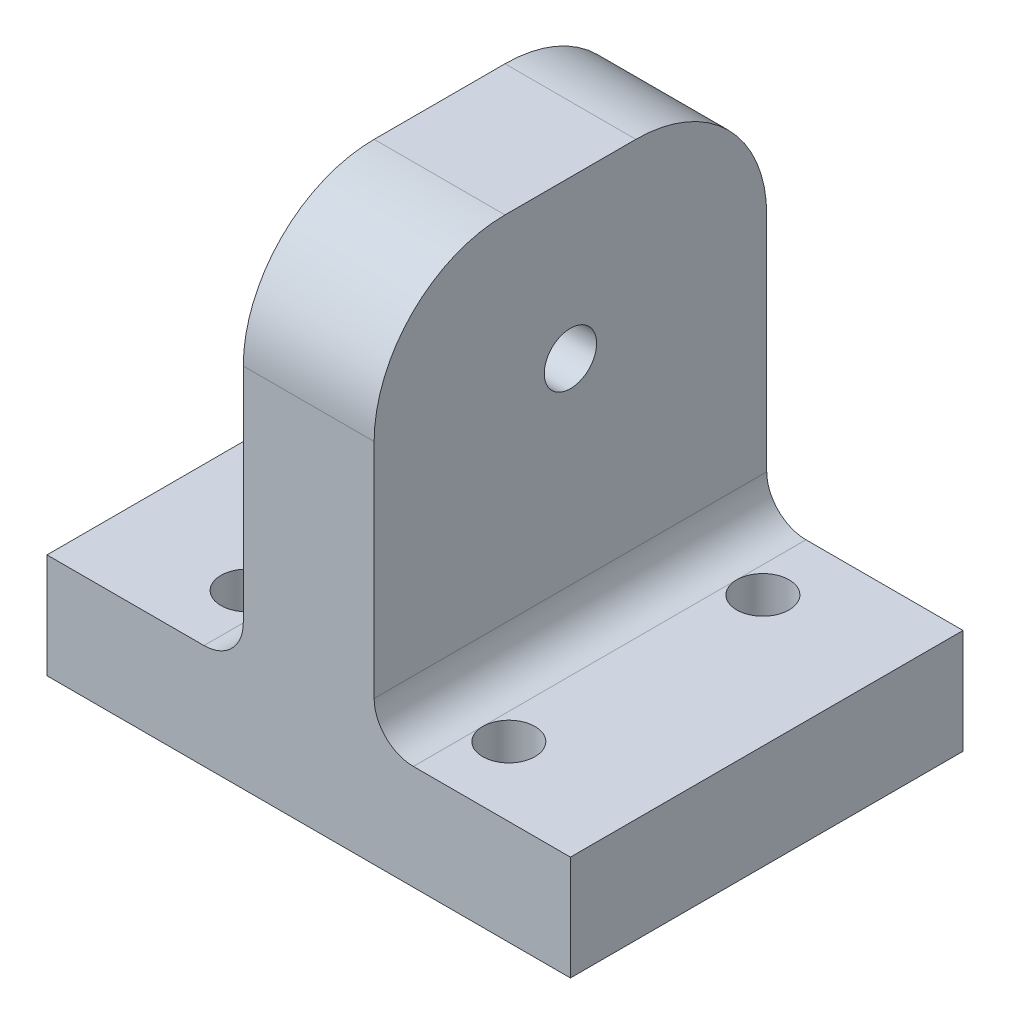
ISO-10303-21;
HEADER;
FILE_DESCRIPTION(('STEP AP214'),'2;1');
FILE_NAME('part.step','',(''),(''),'','','');
FILE_SCHEMA(('AUTOMOTIVE_DESIGN { 1 0 10303 214 1 1 1 1 }'));
ENDSEC;
DATA;
#1=APPLICATION_CONTEXT('core data for automotive mechanical design processes');
#2=APPLICATION_PROTOCOL_DEFINITION('international standard','automotive_design',2000,#1);
#3=PRODUCT_CONTEXT('',#1,'mechanical');
#4=PRODUCT('Part','Part','',(#3));
#5=PRODUCT_RELATED_PRODUCT_CATEGORY('part','',(#4));
#6=PRODUCT_DEFINITION_FORMATION('','',#4);
#7=PRODUCT_DEFINITION_CONTEXT('part definition',#1,'design');
#8=PRODUCT_DEFINITION('design','',#6,#7);
#9=PRODUCT_DEFINITION_SHAPE('','',#8);
#10=(LENGTH_UNIT() NAMED_UNIT(*) SI_UNIT(.MILLI.,.METRE.));
#11=(NAMED_UNIT(*) PLANE_ANGLE_UNIT() SI_UNIT($,.RADIAN.));
#12=(NAMED_UNIT(*) SI_UNIT($,.STERADIAN.) SOLID_ANGLE_UNIT());
#13=UNCERTAINTY_MEASURE_WITH_UNIT(LENGTH_MEASURE(1.E-05),#10,'distance_accuracy_value','');
#14=(GEOMETRIC_REPRESENTATION_CONTEXT(3) GLOBAL_UNCERTAINTY_ASSIGNED_CONTEXT((#13)) GLOBAL_UNIT_ASSIGNED_CONTEXT((#10,
#11,#12)) REPRESENTATION_CONTEXT('',''));
#15=CARTESIAN_POINT('',(0.,0.,0.));
#16=DIRECTION('',(0.,0.,1.));
#17=DIRECTION('',(1.,0.,0.));
#18=AXIS2_PLACEMENT_3D('',#15,#16,#17);
#19=CARTESIAN_POINT('',(0.,8.,0.));
#20=DIRECTION('',(0.,1.,0.));
#21=DIRECTION('',(0.,0.,1.));
#22=AXIS2_PLACEMENT_3D('',#19,#20,#21);
#23=PLANE('',#22);
#24=DIRECTION('',(0.,0.,-1.));
#25=VECTOR('',#24,1.);
#26=CARTESIAN_POINT('',(8.,8.,0.));
#27=LINE('',#26,#25);
#28=CARTESIAN_POINT('',(8.,8.,-15.));
#29=VERTEX_POINT('',#28);
#30=CARTESIAN_POINT('',(8.,8.,-9.70683257072213));
#31=VERTEX_POINT('',#30);
#32=EDGE_CURVE('E193',#29,#31,#27,.F.);
#33=ORIENTED_EDGE('',*,*,#32,.T.);
#34=CARTESIAN_POINT('',(10.,8.,-9.70683257072213));
#35=DIRECTION('',(0.,1.,0.));
#36=DIRECTION('',(0.,0.,1.));
#37=AXIS2_PLACEMENT_3D('',#34,#35,#36);
#38=CIRCLE('',#37,2.);
#39=EDGE_CURVE('E319',#31,#31,#38,.T.);
#40=ORIENTED_EDGE('',*,*,#39,.F.);
#41=CARTESIAN_POINT('',(8.,8.,9.70683257072212));
#42=VERTEX_POINT('',#41);
#43=EDGE_CURVE('E197',#31,#42,#27,.F.);
#44=ORIENTED_EDGE('',*,*,#43,.T.);
#45=CARTESIAN_POINT('',(10.,8.,9.70683257072212));
#46=DIRECTION('',(0.,1.,0.));
#47=DIRECTION('',(0.,0.,1.));
#48=AXIS2_PLACEMENT_3D('',#45,#46,#47);
#49=CIRCLE('',#48,2.);
#50=EDGE_CURVE('E322',#42,#42,#49,.T.);
#51=ORIENTED_EDGE('',*,*,#50,.F.);
#52=CARTESIAN_POINT('',(8.,8.,15.));
#53=VERTEX_POINT('',#52);
#54=EDGE_CURVE('E192',#42,#53,#27,.F.);
#55=ORIENTED_EDGE('',*,*,#54,.T.);
#56=DIRECTION('',(1.,0.,0.));
#57=VECTOR('',#56,1.);
#58=CARTESIAN_POINT('',(-20.,8.,15.));
#59=LINE('',#58,#57);
#60=CARTESIAN_POINT('',(20.,8.,15.));
#61=VERTEX_POINT('',#60);
#62=EDGE_CURVE('E159',#53,#61,#59,.T.);
#63=ORIENTED_EDGE('',*,*,#62,.T.);
#64=DIRECTION('',(0.,0.,-1.));
#65=VECTOR('',#64,1.);
#66=CARTESIAN_POINT('',(20.,8.,-15.));
#67=LINE('',#66,#65);
#68=CARTESIAN_POINT('',(20.,8.,-15.));
#69=VERTEX_POINT('',#68);
#70=EDGE_CURVE('E157',#61,#69,#67,.T.);
#71=ORIENTED_EDGE('',*,*,#70,.T.);
#72=DIRECTION('',(-1.,0.,0.));
#73=VECTOR('',#72,1.);
#74=CARTESIAN_POINT('',(-20.,8.,-15.));
#75=LINE('',#74,#73);
#76=EDGE_CURVE('E141',#69,#29,#75,.T.);
#77=ORIENTED_EDGE('',*,*,#76,.T.);
#78=EDGE_LOOP('',(#33,#40,#44,#51,#55,#63,#71,#77));
#79=FACE_BOUND('',#78,.T.);
#80=ADVANCED_FACE('F39',(#79),#23,.T.);
#81=CARTESIAN_POINT('',(20.,8.,-15.));
#82=DIRECTION('',(-1.,0.,0.));
#83=DIRECTION('',(0.,0.,1.));
#84=AXIS2_PLACEMENT_3D('',#81,#82,#83);
#85=PLANE('',#84);
#86=DIRECTION('',(0.,0.,-1.));
#87=VECTOR('',#86,1.);
#88=CARTESIAN_POINT('',(20.,0.,-15.));
#89=LINE('',#88,#87);
#90=CARTESIAN_POINT('',(20.,0.,15.));
#91=VERTEX_POINT('',#90);
#92=CARTESIAN_POINT('',(20.,0.,-15.));
#93=VERTEX_POINT('',#92);
#94=EDGE_CURVE('E168',#91,#93,#89,.T.);
#95=ORIENTED_EDGE('',*,*,#94,.T.);
#96=DIRECTION('',(0.,-1.,0.));
#97=VECTOR('',#96,1.);
#98=CARTESIAN_POINT('',(20.,8.,-15.));
#99=LINE('',#98,#97);
#100=EDGE_CURVE('E145',#69,#93,#99,.T.);
#101=ORIENTED_EDGE('',*,*,#100,.F.);
#102=ORIENTED_EDGE('',*,*,#70,.F.);
#103=DIRECTION('',(0.,-1.,0.));
#104=VECTOR('',#103,1.);
#105=CARTESIAN_POINT('',(20.,8.,15.));
#106=LINE('',#105,#104);
#107=EDGE_CURVE('E268',#61,#91,#106,.T.);
#108=ORIENTED_EDGE('',*,*,#107,.T.);
#109=EDGE_LOOP('',(#95,#101,#102,#108));
#110=FACE_BOUND('',#109,.T.);
#111=ADVANCED_FACE('F166',(#110),#85,.F.);
#112=CARTESIAN_POINT('',(-20.,8.,-15.));
#113=DIRECTION('',(0.,0.,1.));
#114=DIRECTION('',(1.,0.,0.));
#115=AXIS2_PLACEMENT_3D('',#112,#113,#114);
#116=PLANE('',#115);
#117=DIRECTION('',(0.,-1.,0.));
#118=VECTOR('',#117,1.);
#119=CARTESIAN_POINT('',(-5.,38.,-15.));
#120=LINE('',#119,#118);
#121=CARTESIAN_POINT('',(-5.,28.,-15.));
#122=VERTEX_POINT('',#121);
#123=CARTESIAN_POINT('',(-5.,11.,-15.));
#124=VERTEX_POINT('',#123);
#125=EDGE_CURVE('E253',#122,#124,#120,.T.);
#126=ORIENTED_EDGE('',*,*,#125,.F.);
#127=DIRECTION('',(-1.,0.,0.));
#128=VECTOR('',#127,1.);
#129=CARTESIAN_POINT('',(5.,28.,-15.));
#130=LINE('',#129,#128);
#131=CARTESIAN_POINT('',(5.,28.,-15.));
#132=VERTEX_POINT('',#131);
#133=EDGE_CURVE('E11',#122,#132,#130,.F.);
#134=ORIENTED_EDGE('',*,*,#133,.T.);
#135=DIRECTION('',(0.,-1.,0.));
#136=VECTOR('',#135,1.);
#137=CARTESIAN_POINT('',(5.,38.,-15.));
#138=LINE('',#137,#136);
#139=CARTESIAN_POINT('',(5.,11.,-15.));
#140=VERTEX_POINT('',#139);
#141=EDGE_CURVE('E259',#132,#140,#138,.T.);
#142=ORIENTED_EDGE('',*,*,#141,.T.);
#143=CARTESIAN_POINT('',(8.,11.,-15.));
#144=DIRECTION('',(0.,0.,1.));
#145=DIRECTION('',(1.,0.,0.));
#146=AXIS2_PLACEMENT_3D('',#143,#144,#145);
#147=CIRCLE('',#146,3.);
#148=EDGE_CURVE('E148',#140,#29,#147,.T.);
#149=ORIENTED_EDGE('',*,*,#148,.T.);
#150=ORIENTED_EDGE('',*,*,#76,.F.);
#151=ORIENTED_EDGE('',*,*,#100,.T.);
#152=DIRECTION('',(-1.,0.,0.));
#153=VECTOR('',#152,1.);
#154=CARTESIAN_POINT('',(-20.,0.,-15.));
#155=LINE('',#154,#153);
#156=CARTESIAN_POINT('',(-20.,0.,-15.));
#157=VERTEX_POINT('',#156);
#158=EDGE_CURVE('E271',#93,#157,#155,.T.);
#159=ORIENTED_EDGE('',*,*,#158,.T.);
#160=DIRECTION('',(0.,-1.,0.));
#161=VECTOR('',#160,1.);
#162=CARTESIAN_POINT('',(-20.,8.,-15.));
#163=LINE('',#162,#161);
#164=CARTESIAN_POINT('',(-20.,8.,-15.));
#165=VERTEX_POINT('',#164);
#166=EDGE_CURVE('E171',#165,#157,#163,.T.);
#167=ORIENTED_EDGE('',*,*,#166,.F.);
#168=CARTESIAN_POINT('',(-8.,8.,-15.));
#169=VERTEX_POINT('',#168);
#170=EDGE_CURVE('E154',#169,#165,#75,.T.);
#171=ORIENTED_EDGE('',*,*,#170,.F.);
#172=CARTESIAN_POINT('',(-8.,11.,-15.));
#173=DIRECTION('',(0.,0.,1.));
#174=DIRECTION('',(1.,0.,0.));
#175=AXIS2_PLACEMENT_3D('',#172,#173,#174);
#176=CIRCLE('',#175,3.);
#177=EDGE_CURVE('E200',#169,#124,#176,.T.);
#178=ORIENTED_EDGE('',*,*,#177,.T.);
#179=EDGE_LOOP('',(#126,#134,#142,#149,#150,#151,#159,#167,#171,#178));
#180=FACE_BOUND('',#179,.T.);
#181=ADVANCED_FACE('F143',(#180),#116,.F.);
#182=CARTESIAN_POINT('',(-20.,8.,-15.));
#183=DIRECTION('',(1.,0.,0.));
#184=DIRECTION('',(0.,0.,-1.));
#185=AXIS2_PLACEMENT_3D('',#182,#183,#184);
#186=PLANE('',#185);
#187=DIRECTION('',(0.,0.,1.));
#188=VECTOR('',#187,1.);
#189=CARTESIAN_POINT('',(-20.,0.,-15.));
#190=LINE('',#189,#188);
#191=CARTESIAN_POINT('',(-20.,0.,15.));
#192=VERTEX_POINT('',#191);
#193=EDGE_CURVE('E274',#157,#192,#190,.T.);
#194=ORIENTED_EDGE('',*,*,#193,.T.);
#195=DIRECTION('',(0.,-1.,0.));
#196=VECTOR('',#195,1.);
#197=CARTESIAN_POINT('',(-20.,8.,15.));
#198=LINE('',#197,#196);
#199=CARTESIAN_POINT('',(-20.,8.,15.));
#200=VERTEX_POINT('',#199);
#201=EDGE_CURVE('E179',#200,#192,#198,.T.);
#202=ORIENTED_EDGE('',*,*,#201,.F.);
#203=DIRECTION('',(0.,0.,1.));
#204=VECTOR('',#203,1.);
#205=CARTESIAN_POINT('',(-20.,8.,-15.));
#206=LINE('',#205,#204);
#207=EDGE_CURVE('E153',#165,#200,#206,.T.);
#208=ORIENTED_EDGE('',*,*,#207,.F.);
#209=ORIENTED_EDGE('',*,*,#166,.T.);
#210=EDGE_LOOP('',(#194,#202,#208,#209));
#211=FACE_BOUND('',#210,.T.);
#212=ADVANCED_FACE('F292',(#211),#186,.F.);
#213=CARTESIAN_POINT('',(-20.,8.,15.));
#214=DIRECTION('',(0.,0.,-1.));
#215=DIRECTION('',(-1.,0.,0.));
#216=AXIS2_PLACEMENT_3D('',#213,#214,#215);
#217=PLANE('',#216);
#218=DIRECTION('',(0.,-1.,0.));
#219=VECTOR('',#218,1.);
#220=CARTESIAN_POINT('',(5.,38.,15.));
#221=LINE('',#220,#219);
#222=CARTESIAN_POINT('',(5.,28.,15.));
#223=VERTEX_POINT('',#222);
#224=CARTESIAN_POINT('',(5.,11.,15.));
#225=VERTEX_POINT('',#224);
#226=EDGE_CURVE('E241',#223,#225,#221,.T.);
#227=ORIENTED_EDGE('',*,*,#226,.F.);
#228=DIRECTION('',(1.,0.,0.));
#229=VECTOR('',#228,1.);
#230=CARTESIAN_POINT('',(-5.,28.,15.));
#231=LINE('',#230,#229);
#232=CARTESIAN_POINT('',(-5.,28.,15.));
#233=VERTEX_POINT('',#232);
#234=EDGE_CURVE('E63',#223,#233,#231,.F.);
#235=ORIENTED_EDGE('',*,*,#234,.T.);
#236=DIRECTION('',(0.,-1.,0.));
#237=VECTOR('',#236,1.);
#238=CARTESIAN_POINT('',(-5.,38.,15.));
#239=LINE('',#238,#237);
#240=CARTESIAN_POINT('',(-5.,11.,15.));
#241=VERTEX_POINT('',#240);
#242=EDGE_CURVE('E232',#233,#241,#239,.T.);
#243=ORIENTED_EDGE('',*,*,#242,.T.);
#244=CARTESIAN_POINT('',(-8.,11.,15.));
#245=DIRECTION('',(0.,0.,-1.));
#246=DIRECTION('',(-1.,0.,0.));
#247=AXIS2_PLACEMENT_3D('',#244,#245,#246);
#248=CIRCLE('',#247,3.);
#249=CARTESIAN_POINT('',(-8.,8.,15.));
#250=VERTEX_POINT('',#249);
#251=EDGE_CURVE('E196',#241,#250,#248,.T.);
#252=ORIENTED_EDGE('',*,*,#251,.T.);
#253=EDGE_CURVE('E264',#200,#250,#59,.T.);
#254=ORIENTED_EDGE('',*,*,#253,.F.);
#255=ORIENTED_EDGE('',*,*,#201,.T.);
#256=DIRECTION('',(1.,0.,0.));
#257=VECTOR('',#256,1.);
#258=CARTESIAN_POINT('',(-20.,0.,15.));
#259=LINE('',#258,#257);
#260=EDGE_CURVE('E164',#192,#91,#259,.T.);
#261=ORIENTED_EDGE('',*,*,#260,.T.);
#262=ORIENTED_EDGE('',*,*,#107,.F.);
#263=ORIENTED_EDGE('',*,*,#62,.F.);
#264=CARTESIAN_POINT('',(8.,11.,15.));
#265=DIRECTION('',(0.,0.,-1.));
#266=DIRECTION('',(-1.,0.,0.));
#267=AXIS2_PLACEMENT_3D('',#264,#265,#266);
#268=CIRCLE('',#267,3.);
#269=EDGE_CURVE('E206',#53,#225,#268,.T.);
#270=ORIENTED_EDGE('',*,*,#269,.T.);
#271=EDGE_LOOP('',(#227,#235,#243,#252,#254,#255,#261,#262,#263,#270));
#272=FACE_BOUND('',#271,.T.);
#273=ADVANCED_FACE('F247',(#272),#217,.F.);
#274=DIRECTION('',(0.,0.,1.));
#275=VECTOR('',#274,1.);
#276=CARTESIAN_POINT('',(-8.,8.,0.));
#277=LINE('',#276,#275);
#278=CARTESIAN_POINT('',(-8.,8.,9.70683257072212));
#279=VERTEX_POINT('',#278);
#280=CARTESIAN_POINT('',(-8.,8.,-9.70683257072212));
#281=VERTEX_POINT('',#280);
#282=EDGE_CURVE('E188',#279,#281,#277,.F.);
#283=ORIENTED_EDGE('',*,*,#282,.T.);
#284=CARTESIAN_POINT('',(-10.,8.,-9.70683257072212));
#285=DIRECTION('',(0.,1.,0.));
#286=DIRECTION('',(0.,0.,1.));
#287=AXIS2_PLACEMENT_3D('',#284,#285,#286);
#288=CIRCLE('',#287,2.);
#289=EDGE_CURVE('E312',#281,#281,#288,.T.);
#290=ORIENTED_EDGE('',*,*,#289,.F.);
#291=EDGE_CURVE('E176',#281,#169,#277,.F.);
#292=ORIENTED_EDGE('',*,*,#291,.T.);
#293=ORIENTED_EDGE('',*,*,#170,.T.);
#294=ORIENTED_EDGE('',*,*,#207,.T.);
#295=ORIENTED_EDGE('',*,*,#253,.T.);
#296=EDGE_CURVE('E183',#250,#279,#277,.F.);
#297=ORIENTED_EDGE('',*,*,#296,.T.);
#298=CARTESIAN_POINT('',(-10.,8.,9.70683257072212));
#299=DIRECTION('',(0.,1.,0.));
#300=DIRECTION('',(0.,0.,1.));
#301=AXIS2_PLACEMENT_3D('',#298,#299,#300);
#302=CIRCLE('',#301,2.);
#303=EDGE_CURVE('E314',#279,#279,#302,.T.);
#304=ORIENTED_EDGE('',*,*,#303,.F.);
#305=EDGE_LOOP('',(#283,#290,#292,#293,#294,#295,#297,#304));
#306=FACE_BOUND('',#305,.T.);
#307=ADVANCED_FACE('F295',(#306),#23,.T.);
#308=CARTESIAN_POINT('',(0.,0.,0.));
#309=DIRECTION('',(0.,1.,0.));
#310=DIRECTION('',(0.,0.,1.));
#311=AXIS2_PLACEMENT_3D('',#308,#309,#310);
#312=PLANE('',#311);
#313=CARTESIAN_POINT('',(-10.,0.,-9.70683257072212));
#314=DIRECTION('',(0.,-1.,0.));
#315=DIRECTION('',(0.,0.,1.));
#316=AXIS2_PLACEMENT_3D('',#313,#314,#315);
#317=CIRCLE('',#316,2.);
#318=CARTESIAN_POINT('',(-10.,0.,-7.70683257072212));
#319=VERTEX_POINT('',#318);
#320=EDGE_CURVE('E330',#319,#319,#317,.T.);
#321=ORIENTED_EDGE('',*,*,#320,.F.);
#322=EDGE_LOOP('',(#321));
#323=FACE_BOUND('',#322,.T.);
#324=CARTESIAN_POINT('',(10.,0.,-9.70683257072213));
#325=DIRECTION('',(0.,-1.,0.));
#326=DIRECTION('',(0.,0.,-1.));
#327=AXIS2_PLACEMENT_3D('',#324,#325,#326);
#328=CIRCLE('',#327,2.);
#329=CARTESIAN_POINT('',(10.,0.,-11.7068325707221));
#330=VERTEX_POINT('',#329);
#331=EDGE_CURVE('E334',#330,#330,#328,.T.);
#332=ORIENTED_EDGE('',*,*,#331,.F.);
#333=EDGE_LOOP('',(#332));
#334=FACE_BOUND('',#333,.T.);
#335=CARTESIAN_POINT('',(10.,0.,9.70683257072212));
#336=DIRECTION('',(0.,-1.,0.));
#337=DIRECTION('',(0.,0.,1.));
#338=AXIS2_PLACEMENT_3D('',#335,#336,#337);
#339=CIRCLE('',#338,2.);
#340=CARTESIAN_POINT('',(10.,0.,11.7068325707221));
#341=VERTEX_POINT('',#340);
#342=EDGE_CURVE('E329',#341,#341,#339,.T.);
#343=ORIENTED_EDGE('',*,*,#342,.F.);
#344=EDGE_LOOP('',(#343));
#345=FACE_BOUND('',#344,.T.);
#346=CARTESIAN_POINT('',(-10.,0.,9.70683257072212));
#347=DIRECTION('',(0.,-1.,0.));
#348=DIRECTION('',(0.,0.,-1.));
#349=AXIS2_PLACEMENT_3D('',#346,#347,#348);
#350=CIRCLE('',#349,2.);
#351=CARTESIAN_POINT('',(-10.,0.,7.70683257072212));
#352=VERTEX_POINT('',#351);
#353=EDGE_CURVE('E325',#352,#352,#350,.T.);
#354=ORIENTED_EDGE('',*,*,#353,.F.);
#355=EDGE_LOOP('',(#354));
#356=FACE_BOUND('',#355,.T.);
#357=ORIENTED_EDGE('',*,*,#94,.F.);
#358=ORIENTED_EDGE('',*,*,#260,.F.);
#359=ORIENTED_EDGE('',*,*,#193,.F.);
#360=ORIENTED_EDGE('',*,*,#158,.F.);
#361=EDGE_LOOP('',(#357,#358,#359,#360));
#362=FACE_BOUND('',#361,.T.);
#363=ADVANCED_FACE('F289',(#323,#334,#345,#356,#362),#312,.F.);
#364=CARTESIAN_POINT('',(5.,38.,-15.));
#365=DIRECTION('',(-1.,0.,0.));
#366=DIRECTION('',(0.,0.,1.));
#367=AXIS2_PLACEMENT_3D('',#364,#365,#366);
#368=PLANE('',#367);
#369=CARTESIAN_POINT('',(5.,26.,0.));
#370=DIRECTION('',(1.,0.,0.));
#371=DIRECTION('',(0.,0.,-1.));
#372=AXIS2_PLACEMENT_3D('',#369,#370,#371);
#373=CIRCLE('',#372,2.);
#374=CARTESIAN_POINT('',(5.,26.,-2.));
#375=VERTEX_POINT('',#374);
#376=EDGE_CURVE('E342',#375,#375,#373,.T.);
#377=ORIENTED_EDGE('',*,*,#376,.F.);
#378=EDGE_LOOP('',(#377));
#379=FACE_BOUND('',#378,.T.);
#380=DIRECTION('',(0.,0.,-1.));
#381=VECTOR('',#380,1.);
#382=CARTESIAN_POINT('',(5.,38.,-15.));
#383=LINE('',#382,#381);
#384=CARTESIAN_POINT('',(5.,38.,4.99999999999999));
#385=VERTEX_POINT('',#384);
#386=CARTESIAN_POINT('',(5.,38.,-5.00000000000001));
#387=VERTEX_POINT('',#386);
#388=EDGE_CURVE('E242',#385,#387,#383,.T.);
#389=ORIENTED_EDGE('',*,*,#388,.F.);
#390=CARTESIAN_POINT('',(5.,28.,4.99999999999999));
#391=DIRECTION('',(-1.,0.,0.));
#392=DIRECTION('',(0.,0.,1.));
#393=AXIS2_PLACEMENT_3D('',#390,#391,#392);
#394=CIRCLE('',#393,10.);
#395=EDGE_CURVE('E221',#385,#223,#394,.F.);
#396=ORIENTED_EDGE('',*,*,#395,.T.);
#397=ORIENTED_EDGE('',*,*,#226,.T.);
#398=DIRECTION('',(0.,0.,-1.));
#399=VECTOR('',#398,1.);
#400=CARTESIAN_POINT('',(5.,11.,-15.));
#401=LINE('',#400,#399);
#402=EDGE_CURVE('E187',#225,#140,#401,.T.);
#403=ORIENTED_EDGE('',*,*,#402,.T.);
#404=ORIENTED_EDGE('',*,*,#141,.F.);
#405=CARTESIAN_POINT('',(5.,28.,-5.));
#406=DIRECTION('',(-1.,0.,0.));
#407=DIRECTION('',(0.,0.,1.));
#408=AXIS2_PLACEMENT_3D('',#405,#406,#407);
#409=CIRCLE('',#408,10.);
#410=EDGE_CURVE('E218',#132,#387,#409,.F.);
#411=ORIENTED_EDGE('',*,*,#410,.T.);
#412=EDGE_LOOP('',(#389,#396,#397,#403,#404,#411));
#413=FACE_BOUND('',#412,.T.);
#414=ADVANCED_FACE('F246',(#379,#413),#368,.F.);
#415=CARTESIAN_POINT('',(-5.,38.,-15.));
#416=DIRECTION('',(1.,0.,0.));
#417=DIRECTION('',(0.,0.,-1.));
#418=AXIS2_PLACEMENT_3D('',#415,#416,#417);
#419=PLANE('',#418);
#420=CARTESIAN_POINT('',(-5.,26.,0.));
#421=DIRECTION('',(1.,0.,0.));
#422=DIRECTION('',(0.,0.,-1.));
#423=AXIS2_PLACEMENT_3D('',#420,#421,#422);
#424=CIRCLE('',#423,2.);
#425=CARTESIAN_POINT('',(-5.,26.,-2.));
#426=VERTEX_POINT('',#425);
#427=EDGE_CURVE('E335',#426,#426,#424,.T.);
#428=ORIENTED_EDGE('',*,*,#427,.T.);
#429=EDGE_LOOP('',(#428));
#430=FACE_BOUND('',#429,.T.);
#431=ORIENTED_EDGE('',*,*,#242,.F.);
#432=CARTESIAN_POINT('',(-5.,28.,4.99999999999999));
#433=DIRECTION('',(1.,0.,0.));
#434=DIRECTION('',(0.,0.,-1.));
#435=AXIS2_PLACEMENT_3D('',#432,#433,#434);
#436=CIRCLE('',#435,10.);
#437=CARTESIAN_POINT('',(-5.,38.,4.99999999999999));
#438=VERTEX_POINT('',#437);
#439=EDGE_CURVE('E48',#233,#438,#436,.F.);
#440=ORIENTED_EDGE('',*,*,#439,.T.);
#441=DIRECTION('',(0.,0.,1.));
#442=VECTOR('',#441,1.);
#443=CARTESIAN_POINT('',(-5.,38.,-15.));
#444=LINE('',#443,#442);
#445=CARTESIAN_POINT('',(-5.,38.,-5.00000000000001));
#446=VERTEX_POINT('',#445);
#447=EDGE_CURVE('E231',#446,#438,#444,.T.);
#448=ORIENTED_EDGE('',*,*,#447,.F.);
#449=CARTESIAN_POINT('',(-5.,28.,-5.));
#450=DIRECTION('',(1.,0.,0.));
#451=DIRECTION('',(0.,0.,-1.));
#452=AXIS2_PLACEMENT_3D('',#449,#450,#451);
#453=CIRCLE('',#452,10.);
#454=EDGE_CURVE('E55',#446,#122,#453,.F.);
#455=ORIENTED_EDGE('',*,*,#454,.T.);
#456=ORIENTED_EDGE('',*,*,#125,.T.);
#457=DIRECTION('',(0.,0.,1.));
#458=VECTOR('',#457,1.);
#459=CARTESIAN_POINT('',(-5.,11.,-15.));
#460=LINE('',#459,#458);
#461=EDGE_CURVE('E170',#124,#241,#460,.T.);
#462=ORIENTED_EDGE('',*,*,#461,.T.);
#463=EDGE_LOOP('',(#431,#440,#448,#455,#456,#462));
#464=FACE_BOUND('',#463,.T.);
#465=ADVANCED_FACE('F230',(#430,#464),#419,.F.);
#466=CARTESIAN_POINT('',(0.,38.,0.));
#467=DIRECTION('',(0.,1.,0.));
#468=DIRECTION('',(0.,0.,1.));
#469=AXIS2_PLACEMENT_3D('',#466,#467,#468);
#470=PLANE('',#469);
#471=ORIENTED_EDGE('',*,*,#447,.T.);
#472=DIRECTION('',(1.,0.,0.));
#473=VECTOR('',#472,1.);
#474=CARTESIAN_POINT('',(5.,38.,4.99999999999999));
#475=LINE('',#474,#473);
#476=EDGE_CURVE('E214',#438,#385,#475,.T.);
#477=ORIENTED_EDGE('',*,*,#476,.T.);
#478=ORIENTED_EDGE('',*,*,#388,.T.);
#479=DIRECTION('',(-1.,0.,0.));
#480=VECTOR('',#479,1.);
#481=CARTESIAN_POINT('',(-5.,38.,-5.));
#482=LINE('',#481,#480);
#483=EDGE_CURVE('E210',#387,#446,#482,.T.);
#484=ORIENTED_EDGE('',*,*,#483,.T.);
#485=EDGE_LOOP('',(#471,#477,#478,#484));
#486=FACE_BOUND('',#485,.T.);
#487=ADVANCED_FACE('F236',(#486),#470,.T.);
#488=CARTESIAN_POINT('',(-8.,11.,-15.));
#489=DIRECTION('',(0.,0.,1.));
#490=DIRECTION('',(1.,0.,0.));
#491=AXIS2_PLACEMENT_3D('',#488,#489,#490);
#492=CYLINDRICAL_SURFACE('',#491,3.);
#493=ORIENTED_EDGE('',*,*,#177,.F.);
#494=ORIENTED_EDGE('',*,*,#291,.F.);
#495=ORIENTED_EDGE('',*,*,#282,.F.);
#496=ORIENTED_EDGE('',*,*,#296,.F.);
#497=ORIENTED_EDGE('',*,*,#251,.F.);
#498=ORIENTED_EDGE('',*,*,#461,.F.);
#499=EDGE_LOOP('',(#493,#494,#495,#496,#497,#498));
#500=FACE_BOUND('',#499,.T.);
#501=ADVANCED_FACE('F304',(#500),#492,.F.);
#502=CARTESIAN_POINT('',(8.,11.,-15.));
#503=DIRECTION('',(0.,0.,-1.));
#504=DIRECTION('',(-1.,0.,0.));
#505=AXIS2_PLACEMENT_3D('',#502,#503,#504);
#506=CYLINDRICAL_SURFACE('',#505,3.);
#507=ORIENTED_EDGE('',*,*,#269,.F.);
#508=ORIENTED_EDGE('',*,*,#54,.F.);
#509=ORIENTED_EDGE('',*,*,#43,.F.);
#510=ORIENTED_EDGE('',*,*,#32,.F.);
#511=ORIENTED_EDGE('',*,*,#148,.F.);
#512=ORIENTED_EDGE('',*,*,#402,.F.);
#513=EDGE_LOOP('',(#507,#508,#509,#510,#511,#512));
#514=FACE_BOUND('',#513,.T.);
#515=ADVANCED_FACE('F387',(#514),#506,.F.);
#516=CARTESIAN_POINT('',(-10.,30.,9.70683257072212));
#517=DIRECTION('',(0.,-1.,0.));
#518=DIRECTION('',(0.,0.,-1.));
#519=AXIS2_PLACEMENT_3D('',#516,#517,#518);
#520=CYLINDRICAL_SURFACE('',#519,2.);
#521=ORIENTED_EDGE('',*,*,#303,.T.);
#522=EDGE_LOOP('',(#521));
#523=FACE_BOUND('',#522,.T.);
#524=ORIENTED_EDGE('',*,*,#353,.T.);
#525=EDGE_LOOP('',(#524));
#526=FACE_BOUND('',#525,.T.);
#527=ADVANCED_FACE('F389',(#523,#526),#520,.F.);
#528=CARTESIAN_POINT('',(10.,30.,9.70683257072212));
#529=DIRECTION('',(0.,-1.,0.));
#530=DIRECTION('',(0.,0.,-1.));
#531=AXIS2_PLACEMENT_3D('',#528,#529,#530);
#532=CYLINDRICAL_SURFACE('',#531,2.);
#533=ORIENTED_EDGE('',*,*,#50,.T.);
#534=EDGE_LOOP('',(#533));
#535=FACE_BOUND('',#534,.T.);
#536=ORIENTED_EDGE('',*,*,#342,.T.);
#537=EDGE_LOOP('',(#536));
#538=FACE_BOUND('',#537,.T.);
#539=ADVANCED_FACE('F458',(#535,#538),#532,.F.);
#540=CARTESIAN_POINT('',(10.,30.,-9.70683257072213));
#541=DIRECTION('',(0.,-1.,0.));
#542=DIRECTION('',(0.,0.,-1.));
#543=AXIS2_PLACEMENT_3D('',#540,#541,#542);
#544=CYLINDRICAL_SURFACE('',#543,2.);
#545=ORIENTED_EDGE('',*,*,#39,.T.);
#546=EDGE_LOOP('',(#545));
#547=FACE_BOUND('',#546,.T.);
#548=ORIENTED_EDGE('',*,*,#331,.T.);
#549=EDGE_LOOP('',(#548));
#550=FACE_BOUND('',#549,.T.);
#551=ADVANCED_FACE('F448',(#547,#550),#544,.F.);
#552=CARTESIAN_POINT('',(-10.,30.,-9.70683257072212));
#553=DIRECTION('',(0.,-1.,0.));
#554=DIRECTION('',(0.,0.,-1.));
#555=AXIS2_PLACEMENT_3D('',#552,#553,#554);
#556=CYLINDRICAL_SURFACE('',#555,2.);
#557=ORIENTED_EDGE('',*,*,#289,.T.);
#558=EDGE_LOOP('',(#557));
#559=FACE_BOUND('',#558,.T.);
#560=ORIENTED_EDGE('',*,*,#320,.T.);
#561=EDGE_LOOP('',(#560));
#562=FACE_BOUND('',#561,.T.);
#563=ADVANCED_FACE('F354',(#559,#562),#556,.F.);
#564=CARTESIAN_POINT('',(-5.,26.,0.));
#565=DIRECTION('',(1.,0.,0.));
#566=DIRECTION('',(0.,0.,-1.));
#567=AXIS2_PLACEMENT_3D('',#564,#565,#566);
#568=CYLINDRICAL_SURFACE('',#567,2.);
#569=ORIENTED_EDGE('',*,*,#427,.F.);
#570=EDGE_LOOP('',(#569));
#571=FACE_BOUND('',#570,.T.);
#572=ORIENTED_EDGE('',*,*,#376,.T.);
#573=EDGE_LOOP('',(#572));
#574=FACE_BOUND('',#573,.T.);
#575=ADVANCED_FACE('F351',(#571,#574),#568,.F.);
#576=CARTESIAN_POINT('',(0.,28.,4.99999999999999));
#577=DIRECTION('',(-1.,0.,0.));
#578=DIRECTION('',(0.,0.,1.));
#579=AXIS2_PLACEMENT_3D('',#576,#577,#578);
#580=CYLINDRICAL_SURFACE('',#579,10.);
#581=ORIENTED_EDGE('',*,*,#439,.F.);
#582=ORIENTED_EDGE('',*,*,#234,.F.);
#583=ORIENTED_EDGE('',*,*,#395,.F.);
#584=ORIENTED_EDGE('',*,*,#476,.F.);
#585=EDGE_LOOP('',(#581,#582,#583,#584));
#586=FACE_BOUND('',#585,.T.);
#587=ADVANCED_FACE('F244',(#586),#580,.T.);
#588=CARTESIAN_POINT('',(0.,28.,-5.));
#589=DIRECTION('',(1.,0.,0.));
#590=DIRECTION('',(0.,0.,-1.));
#591=AXIS2_PLACEMENT_3D('',#588,#589,#590);
#592=CYLINDRICAL_SURFACE('',#591,10.);
#593=ORIENTED_EDGE('',*,*,#410,.F.);
#594=ORIENTED_EDGE('',*,*,#133,.F.);
#595=ORIENTED_EDGE('',*,*,#454,.F.);
#596=ORIENTED_EDGE('',*,*,#483,.F.);
#597=EDGE_LOOP('',(#593,#594,#595,#596));
#598=FACE_BOUND('',#597,.T.);
#599=ADVANCED_FACE('F41',(#598),#592,.T.);
#600=CLOSED_SHELL('',(#80,#111,#181,#212,#273,#307,#363,#414,#465,#487,#501,#515,#527,#539,#551,
#563,#575,#587,#599));
#601=MANIFOLD_SOLID_BREP('B2',#600);
#602=ADVANCED_BREP_SHAPE_REPRESENTATION('',(#18,#601),#14);
#603=SHAPE_DEFINITION_REPRESENTATION(#9,#602);
ENDSEC;
END-ISO-10303-21;
